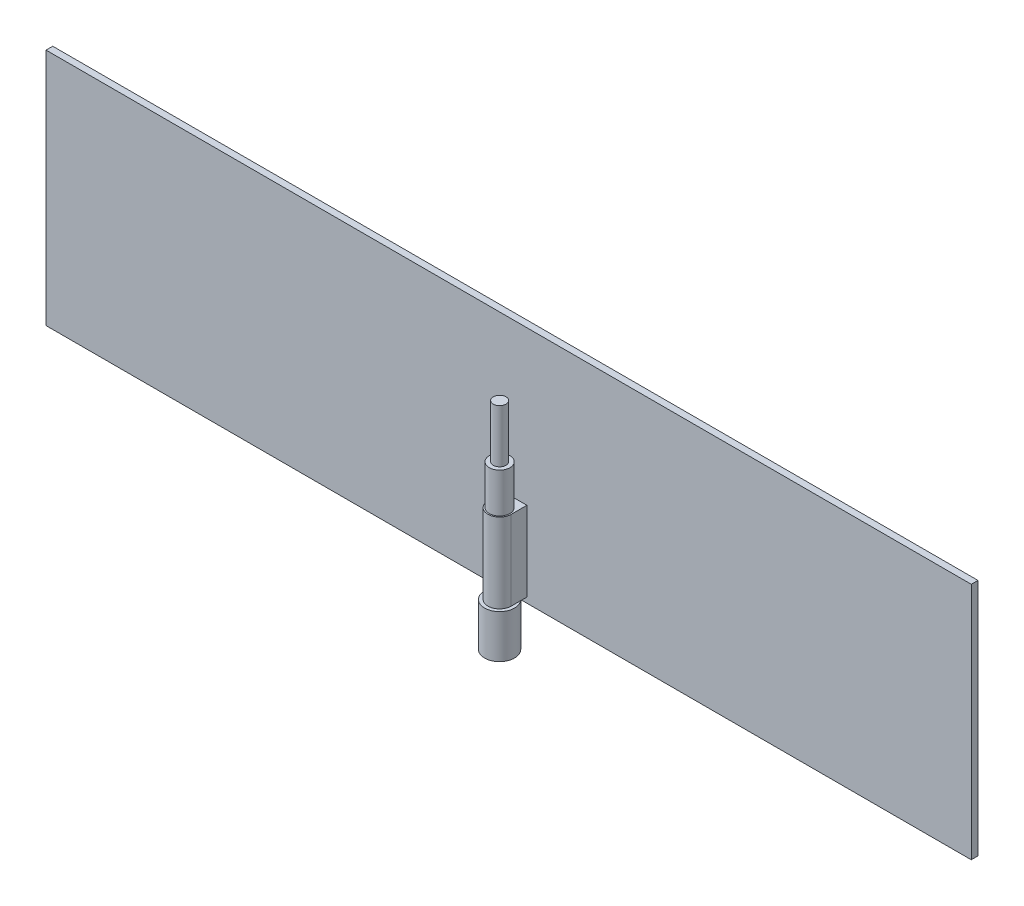
ISO-10303-21;
HEADER;
FILE_DESCRIPTION(('STEP AP214'),'2;1');
FILE_NAME('part.step','',(''),(''),'','','');
FILE_SCHEMA(('AUTOMOTIVE_DESIGN { 1 0 10303 214 1 1 1 1 }'));
ENDSEC;
DATA;
#1=APPLICATION_CONTEXT('core data for automotive mechanical design processes');
#2=APPLICATION_PROTOCOL_DEFINITION('international standard','automotive_design',2000,#1);
#3=PRODUCT_CONTEXT('',#1,'mechanical');
#4=PRODUCT('Part','Part','',(#3));
#5=PRODUCT_RELATED_PRODUCT_CATEGORY('part','',(#4));
#6=PRODUCT_DEFINITION_FORMATION('','',#4);
#7=PRODUCT_DEFINITION_CONTEXT('part definition',#1,'design');
#8=PRODUCT_DEFINITION('design','',#6,#7);
#9=PRODUCT_DEFINITION_SHAPE('','',#8);
#10=(LENGTH_UNIT() NAMED_UNIT(*) SI_UNIT(.MILLI.,.METRE.));
#11=(NAMED_UNIT(*) PLANE_ANGLE_UNIT() SI_UNIT($,.RADIAN.));
#12=(NAMED_UNIT(*) SI_UNIT($,.STERADIAN.) SOLID_ANGLE_UNIT());
#13=UNCERTAINTY_MEASURE_WITH_UNIT(LENGTH_MEASURE(1.E-05),#10,'distance_accuracy_value','');
#14=(GEOMETRIC_REPRESENTATION_CONTEXT(3) GLOBAL_UNCERTAINTY_ASSIGNED_CONTEXT((#13)) GLOBAL_UNIT_ASSIGNED_CONTEXT((#10,
#11,#12)) REPRESENTATION_CONTEXT('',''));
#15=CARTESIAN_POINT('',(0.,0.,0.));
#16=DIRECTION('',(0.,0.,1.));
#17=DIRECTION('',(1.,0.,0.));
#18=AXIS2_PLACEMENT_3D('',#15,#16,#17);
#19=CARTESIAN_POINT('',(0.,96.5,1.38499617894251));
#20=DIRECTION('',(0.,-1.,0.));
#21=DIRECTION('',(0.,0.,-1.));
#22=AXIS2_PLACEMENT_3D('',#19,#20,#21);
#23=CYLINDRICAL_SURFACE('',#22,0.389999999999991);
#24=CARTESIAN_POINT('',(0.,98.,1.38499617894251));
#25=DIRECTION('',(0.,-1.,0.));
#26=DIRECTION('',(0.,0.,-1.));
#27=AXIS2_PLACEMENT_3D('',#24,#25,#26);
#28=CIRCLE('',#27,0.389999999999991);
#29=CARTESIAN_POINT('',(0.,98.,0.99499617894252));
#30=VERTEX_POINT('',#29);
#31=EDGE_CURVE('E11',#30,#30,#28,.T.);
#32=ORIENTED_EDGE('',*,*,#31,.T.);
#33=EDGE_LOOP('',(#32));
#34=FACE_BOUND('',#33,.T.);
#35=CARTESIAN_POINT('',(0.,96.5,1.38499617894251));
#36=DIRECTION('',(0.,-1.,0.));
#37=DIRECTION('',(0.,0.,-1.));
#38=AXIS2_PLACEMENT_3D('',#35,#36,#37);
#39=CIRCLE('',#38,0.389999999999991);
#40=CARTESIAN_POINT('',(0.,96.5,0.99499617894252));
#41=VERTEX_POINT('',#40);
#42=EDGE_CURVE('E265',#41,#41,#39,.T.);
#43=ORIENTED_EDGE('',*,*,#42,.F.);
#44=EDGE_LOOP('',(#43));
#45=FACE_BOUND('',#44,.T.);
#46=ADVANCED_FACE('F51',(#34,#45),#23,.T.);
#47=CARTESIAN_POINT('',(0.,98.,1.6249961789425));
#48=DIRECTION('',(0.,-1.,0.));
#49=DIRECTION('',(0.,0.,-1.));
#50=AXIS2_PLACEMENT_3D('',#47,#48,#49);
#51=PLANE('',#50);
#52=CARTESIAN_POINT('',(0.,98.,1.38499617894251));
#53=DIRECTION('',(0.,-1.,0.));
#54=DIRECTION('',(0.,0.,-1.));
#55=AXIS2_PLACEMENT_3D('',#52,#53,#54);
#56=CIRCLE('',#55,0.239999999999991);
#57=CARTESIAN_POINT('',(0.,98.,1.14499617894252));
#58=VERTEX_POINT('',#57);
#59=EDGE_CURVE('E65',#58,#58,#56,.T.);
#60=ORIENTED_EDGE('',*,*,#59,.T.);
#61=EDGE_LOOP('',(#60));
#62=FACE_BOUND('',#61,.T.);
#63=ORIENTED_EDGE('',*,*,#31,.F.);
#64=EDGE_LOOP('',(#63));
#65=FACE_BOUND('',#64,.T.);
#66=ADVANCED_FACE('F322',(#62,#65),#51,.F.);
#67=CARTESIAN_POINT('',(0.,96.5,1.38499617894251));
#68=DIRECTION('',(0.,-1.,0.));
#69=DIRECTION('',(0.,0.,-1.));
#70=AXIS2_PLACEMENT_3D('',#67,#68,#69);
#71=CYLINDRICAL_SURFACE('',#70,0.239999999999991);
#72=CARTESIAN_POINT('',(0.,100.,1.38499617894251));
#73=DIRECTION('',(0.,-1.,0.));
#74=DIRECTION('',(0.,0.,-1.));
#75=AXIS2_PLACEMENT_3D('',#72,#73,#74);
#76=CIRCLE('',#75,0.239999999999991);
#77=CARTESIAN_POINT('',(0.,100.,1.14499617894252));
#78=VERTEX_POINT('',#77);
#79=EDGE_CURVE('E209',#78,#78,#76,.T.);
#80=ORIENTED_EDGE('',*,*,#79,.T.);
#81=EDGE_LOOP('',(#80));
#82=FACE_BOUND('',#81,.T.);
#83=ORIENTED_EDGE('',*,*,#59,.F.);
#84=EDGE_LOOP('',(#83));
#85=FACE_BOUND('',#84,.T.);
#86=ADVANCED_FACE('F332',(#82,#85),#71,.T.);
#87=CARTESIAN_POINT('',(0.,100.,1.38499617894251));
#88=DIRECTION('',(0.,-1.,0.));
#89=DIRECTION('',(0.,0.,-1.));
#90=AXIS2_PLACEMENT_3D('',#87,#88,#89);
#91=PLANE('',#90);
#92=ORIENTED_EDGE('',*,*,#79,.F.);
#93=EDGE_LOOP('',(#92));
#94=FACE_BOUND('',#93,.T.);
#95=ADVANCED_FACE('F341',(#94),#91,.F.);
#96=CARTESIAN_POINT('',(-0.00206148933976254,93.5,1.38499617894251));
#97=DIRECTION('',(0.,1.,0.));
#98=DIRECTION('',(1.,0.,0.));
#99=AXIS2_PLACEMENT_3D('',#96,#97,#98);
#100=PLANE('',#99);
#101=CARTESIAN_POINT('',(-0.00206148933976254,93.5,1.38499617894251));
#102=DIRECTION('',(0.,-1.,0.));
#103=DIRECTION('',(1.,0.,0.));
#104=AXIS2_PLACEMENT_3D('',#101,#102,#103);
#105=CIRCLE('',#104,0.565);
#106=CARTESIAN_POINT('',(-0.442061489339763,93.5,1.03056000697357));
#107=VERTEX_POINT('',#106);
#108=CARTESIAN_POINT('',(0.437938510660237,93.5,1.03056000697357));
#109=VERTEX_POINT('',#108);
#110=EDGE_CURVE('E261',#107,#109,#105,.T.);
#111=ORIENTED_EDGE('',*,*,#110,.F.);
#112=DIRECTION('',(0.,0.,1.));
#113=VECTOR('',#112,1.);
#114=CARTESIAN_POINT('',(-0.442061489339763,93.5,0.794996178942356));
#115=LINE('',#114,#113);
#116=CARTESIAN_POINT('',(-0.442061489339763,93.5,0.794996178942356));
#117=VERTEX_POINT('',#116);
#118=EDGE_CURVE('E124',#117,#107,#115,.T.);
#119=ORIENTED_EDGE('',*,*,#118,.F.);
#120=DIRECTION('',(-1.,0.,0.));
#121=VECTOR('',#120,1.);
#122=CARTESIAN_POINT('',(0.437938510660237,93.5,0.794996178942356));
#123=LINE('',#122,#121);
#124=CARTESIAN_POINT('',(0.437938510660237,93.5,0.794996178942356));
#125=VERTEX_POINT('',#124);
#126=EDGE_CURVE('E210',#125,#117,#123,.T.);
#127=ORIENTED_EDGE('',*,*,#126,.F.);
#128=DIRECTION('',(0.,0.,-1.));
#129=VECTOR('',#128,1.);
#130=CARTESIAN_POINT('',(0.437938510660237,93.5,1.38499617894251));
#131=LINE('',#130,#129);
#132=EDGE_CURVE('E211',#109,#125,#131,.T.);
#133=ORIENTED_EDGE('',*,*,#132,.F.);
#134=EDGE_LOOP('',(#111,#119,#127,#133));
#135=FACE_BOUND('',#134,.T.);
#136=ADVANCED_FACE('F310',(#135),#100,.F.);
#137=CARTESIAN_POINT('',(-0.00206148933976254,96.5,1.38499617894251));
#138=DIRECTION('',(0.,1.,0.));
#139=DIRECTION('',(1.,0.,0.));
#140=AXIS2_PLACEMENT_3D('',#137,#138,#139);
#141=PLANE('',#140);
#142=CARTESIAN_POINT('',(-0.00206148933976254,96.5,1.38499617894251));
#143=DIRECTION('',(0.,1.,0.));
#144=DIRECTION('',(1.,0.,0.));
#145=AXIS2_PLACEMENT_3D('',#142,#143,#144);
#146=CIRCLE('',#145,0.44);
#147=CARTESIAN_POINT('',(-0.442061489339763,96.5,1.38499617894251));
#148=VERTEX_POINT('',#147);
#149=CARTESIAN_POINT('',(0.437938510660237,96.5,1.38499617894251));
#150=VERTEX_POINT('',#149);
#151=EDGE_CURVE('E252',#148,#150,#146,.T.);
#152=ORIENTED_EDGE('',*,*,#151,.T.);
#153=DIRECTION('',(0.,0.,-1.));
#154=VECTOR('',#153,1.);
#155=CARTESIAN_POINT('',(0.437938510660237,96.5,1.38499617894251));
#156=LINE('',#155,#154);
#157=CARTESIAN_POINT('',(0.437938510660237,96.5,0.794996178942356));
#158=VERTEX_POINT('',#157);
#159=EDGE_CURVE('E213',#150,#158,#156,.T.);
#160=ORIENTED_EDGE('',*,*,#159,.T.);
#161=DIRECTION('',(-1.,0.,0.));
#162=VECTOR('',#161,1.);
#163=CARTESIAN_POINT('',(0.437938510660237,96.5,0.794996178942356));
#164=LINE('',#163,#162);
#165=CARTESIAN_POINT('',(-0.442061489339763,96.5,0.794996178942356));
#166=VERTEX_POINT('',#165);
#167=EDGE_CURVE('E235',#158,#166,#164,.T.);
#168=ORIENTED_EDGE('',*,*,#167,.T.);
#169=DIRECTION('',(0.,0.,1.));
#170=VECTOR('',#169,1.);
#171=CARTESIAN_POINT('',(-0.442061489339763,96.5,0.794996178942356));
#172=LINE('',#171,#170);
#173=EDGE_CURVE('E264',#166,#148,#172,.T.);
#174=ORIENTED_EDGE('',*,*,#173,.T.);
#175=EDGE_LOOP('',(#152,#160,#168,#174));
#176=FACE_BOUND('',#175,.T.);
#177=ORIENTED_EDGE('',*,*,#42,.T.);
#178=EDGE_LOOP('',(#177));
#179=FACE_BOUND('',#178,.T.);
#180=ADVANCED_FACE('F284',(#176,#179),#141,.T.);
#181=CARTESIAN_POINT('',(-0.442061489339763,96.5,0.794996178942356));
#182=DIRECTION('',(1.,0.,0.));
#183=DIRECTION('',(0.,0.,-1.));
#184=AXIS2_PLACEMENT_3D('',#181,#182,#183);
#185=PLANE('',#184);
#186=ORIENTED_EDGE('',*,*,#118,.T.);
#187=DIRECTION('',(0.,0.,1.));
#188=VECTOR('',#187,1.);
#189=CARTESIAN_POINT('',(-0.442061489339763,93.5,0.794996178942356));
#190=LINE('',#189,#188);
#191=CARTESIAN_POINT('',(-0.442061489339763,93.5,1.38499617894251));
#192=VERTEX_POINT('',#191);
#193=EDGE_CURVE('E178',#107,#192,#190,.T.);
#194=ORIENTED_EDGE('',*,*,#193,.T.);
#195=DIRECTION('',(0.,-1.,0.));
#196=VECTOR('',#195,1.);
#197=CARTESIAN_POINT('',(-0.442061489339763,96.5,1.38499617894251));
#198=LINE('',#197,#196);
#199=EDGE_CURVE('E102',#148,#192,#198,.T.);
#200=ORIENTED_EDGE('',*,*,#199,.F.);
#201=ORIENTED_EDGE('',*,*,#173,.F.);
#202=DIRECTION('',(0.,-1.,0.));
#203=VECTOR('',#202,1.);
#204=CARTESIAN_POINT('',(-0.442061489339763,96.5,0.794996178942356));
#205=LINE('',#204,#203);
#206=EDGE_CURVE('E237',#166,#117,#205,.T.);
#207=ORIENTED_EDGE('',*,*,#206,.T.);
#208=EDGE_LOOP('',(#186,#194,#200,#201,#207));
#209=FACE_BOUND('',#208,.T.);
#210=ADVANCED_FACE('F289',(#209),#185,.F.);
#211=CARTESIAN_POINT('',(0.437938510660237,96.5,1.38499617894251));
#212=DIRECTION('',(-1.,0.,0.));
#213=DIRECTION('',(0.,1.,0.));
#214=AXIS2_PLACEMENT_3D('',#211,#212,#213);
#215=PLANE('',#214);
#216=DIRECTION('',(0.,0.,-1.));
#217=VECTOR('',#216,1.);
#218=CARTESIAN_POINT('',(0.437938510660237,93.5,1.38499617894251));
#219=LINE('',#218,#217);
#220=CARTESIAN_POINT('',(0.437938510660237,93.5,1.38499617894251));
#221=VERTEX_POINT('',#220);
#222=EDGE_CURVE('E260',#221,#109,#219,.T.);
#223=ORIENTED_EDGE('',*,*,#222,.T.);
#224=ORIENTED_EDGE('',*,*,#132,.T.);
#225=DIRECTION('',(0.,-1.,0.));
#226=VECTOR('',#225,1.);
#227=CARTESIAN_POINT('',(0.437938510660237,96.5,0.794996178942356));
#228=LINE('',#227,#226);
#229=EDGE_CURVE('E188',#158,#125,#228,.T.);
#230=ORIENTED_EDGE('',*,*,#229,.F.);
#231=ORIENTED_EDGE('',*,*,#159,.F.);
#232=DIRECTION('',(0.,-1.,0.));
#233=VECTOR('',#232,1.);
#234=CARTESIAN_POINT('',(0.437938510660237,96.5,1.38499617894251));
#235=LINE('',#234,#233);
#236=EDGE_CURVE('E256',#150,#221,#235,.T.);
#237=ORIENTED_EDGE('',*,*,#236,.T.);
#238=EDGE_LOOP('',(#223,#224,#230,#231,#237));
#239=FACE_BOUND('',#238,.T.);
#240=ADVANCED_FACE('F52',(#239),#215,.F.);
#241=CARTESIAN_POINT('',(-0.00206148933976254,96.5,1.38499617894251));
#242=DIRECTION('',(0.,-1.,0.));
#243=DIRECTION('',(0.,0.,-1.));
#244=AXIS2_PLACEMENT_3D('',#241,#242,#243);
#245=CYLINDRICAL_SURFACE('',#244,0.44);
#246=CARTESIAN_POINT('',(-0.00206148933976254,93.5,1.38499617894251));
#247=DIRECTION('',(0.,1.,0.));
#248=DIRECTION('',(1.,0.,0.));
#249=AXIS2_PLACEMENT_3D('',#246,#247,#248);
#250=CIRCLE('',#249,0.44);
#251=EDGE_CURVE('E276',#192,#221,#250,.T.);
#252=ORIENTED_EDGE('',*,*,#251,.T.);
#253=ORIENTED_EDGE('',*,*,#236,.F.);
#254=ORIENTED_EDGE('',*,*,#151,.F.);
#255=ORIENTED_EDGE('',*,*,#199,.T.);
#256=EDGE_LOOP('',(#252,#253,#254,#255));
#257=FACE_BOUND('',#256,.T.);
#258=ADVANCED_FACE('F288',(#257),#245,.T.);
#259=CARTESIAN_POINT('',(-0.00206148933976104,9.075,1.38499617894251));
#260=DIRECTION('',(0.,1.,0.));
#261=DIRECTION('',(1.,0.,0.));
#262=AXIS2_PLACEMENT_3D('',#259,#260,#261);
#263=CYLINDRICAL_SURFACE('',#262,0.565);
#264=CARTESIAN_POINT('',(-0.00206148933976104,91.8655364343951,1.3849961789425));
#265=DIRECTION('',(0.,1.,0.));
#266=DIRECTION('',(0.,0.,1.));
#267=AXIS2_PLACEMENT_3D('',#264,#265,#266);
#268=CIRCLE('',#267,0.565);
#269=CARTESIAN_POINT('',(-0.00206148933976104,91.8655364343951,1.9499961789425));
#270=VERTEX_POINT('',#269);
#271=EDGE_CURVE('E54',#270,#270,#268,.F.);
#272=ORIENTED_EDGE('',*,*,#271,.F.);
#273=EDGE_LOOP('',(#272));
#274=FACE_BOUND('',#273,.T.);
#275=ORIENTED_EDGE('',*,*,#110,.T.);
#276=CARTESIAN_POINT('',(-0.00206148933976254,93.5,1.38499617894251));
#277=DIRECTION('',(0.,-1.,0.));
#278=DIRECTION('',(1.,0.,0.));
#279=AXIS2_PLACEMENT_3D('',#276,#277,#278);
#280=CIRCLE('',#279,0.565);
#281=EDGE_CURVE('E255',#109,#107,#280,.T.);
#282=ORIENTED_EDGE('',*,*,#281,.T.);
#283=EDGE_LOOP('',(#275,#282));
#284=FACE_BOUND('',#283,.T.);
#285=ADVANCED_FACE('F307',(#274,#284),#263,.T.);
#286=CARTESIAN_POINT('',(-0.00206148933976254,93.5,1.38499617894251));
#287=DIRECTION('',(0.,-1.,0.));
#288=DIRECTION('',(0.,0.,-1.));
#289=AXIS2_PLACEMENT_3D('',#286,#287,#288);
#290=PLANE('',#289);
#291=ORIENTED_EDGE('',*,*,#193,.F.);
#292=ORIENTED_EDGE('',*,*,#281,.F.);
#293=ORIENTED_EDGE('',*,*,#222,.F.);
#294=ORIENTED_EDGE('',*,*,#251,.F.);
#295=EDGE_LOOP('',(#291,#292,#293,#294));
#296=FACE_BOUND('',#295,.T.);
#297=ADVANCED_FACE('F302',(#296),#290,.F.);
#298=CARTESIAN_POINT('',(-17.7,0.,0.));
#299=DIRECTION('',(1.,0.,0.));
#300=DIRECTION('',(0.,1.,0.));
#301=AXIS2_PLACEMENT_3D('',#298,#299,#300);
#302=PLANE('',#301);
#303=DIRECTION('',(0.,0.,-1.));
#304=VECTOR('',#303,1.);
#305=CARTESIAN_POINT('',(-17.7,93.3,0.794996178942541));
#306=LINE('',#305,#304);
#307=CARTESIAN_POINT('',(-17.7,93.3,0.794996178942541));
#308=VERTEX_POINT('',#307);
#309=CARTESIAN_POINT('',(-17.7,93.3,0.541596178942538));
#310=VERTEX_POINT('',#309);
#311=EDGE_CURVE('E224',#308,#310,#306,.T.);
#312=ORIENTED_EDGE('',*,*,#311,.F.);
#313=DIRECTION('',(0.,-1.,0.));
#314=VECTOR('',#313,1.);
#315=CARTESIAN_POINT('',(-17.7,102.3,0.794996178942541));
#316=LINE('',#315,#314);
#317=CARTESIAN_POINT('',(-17.7,102.3,0.794996178942541));
#318=VERTEX_POINT('',#317);
#319=EDGE_CURVE('E177',#318,#308,#316,.T.);
#320=ORIENTED_EDGE('',*,*,#319,.F.);
#321=DIRECTION('',(0.,0.,1.));
#322=VECTOR('',#321,1.);
#323=CARTESIAN_POINT('',(-17.7,102.3,0.541596178942541));
#324=LINE('',#323,#322);
#325=CARTESIAN_POINT('',(-17.7,102.3,0.541596178942541));
#326=VERTEX_POINT('',#325);
#327=EDGE_CURVE('E193',#326,#318,#324,.T.);
#328=ORIENTED_EDGE('',*,*,#327,.F.);
#329=DIRECTION('',(0.,1.,0.));
#330=VECTOR('',#329,1.);
#331=CARTESIAN_POINT('',(-17.7,93.3,0.541596178942538));
#332=LINE('',#331,#330);
#333=EDGE_CURVE('E231',#310,#326,#332,.T.);
#334=ORIENTED_EDGE('',*,*,#333,.F.);
#335=EDGE_LOOP('',(#312,#320,#328,#334));
#336=FACE_BOUND('',#335,.T.);
#337=ADVANCED_FACE('F319',(#336),#302,.F.);
#338=CARTESIAN_POINT('',(17.2,0.,0.));
#339=DIRECTION('',(1.,0.,0.));
#340=DIRECTION('',(0.,1.,0.));
#341=AXIS2_PLACEMENT_3D('',#338,#339,#340);
#342=PLANE('',#341);
#343=DIRECTION('',(0.,0.,-1.));
#344=VECTOR('',#343,1.);
#345=CARTESIAN_POINT('',(17.2,93.3,0.794996178942541));
#346=LINE('',#345,#344);
#347=CARTESIAN_POINT('',(17.2,93.3,0.794996178942541));
#348=VERTEX_POINT('',#347);
#349=CARTESIAN_POINT('',(17.2,93.3,0.541596178942538));
#350=VERTEX_POINT('',#349);
#351=EDGE_CURVE('E225',#348,#350,#346,.T.);
#352=ORIENTED_EDGE('',*,*,#351,.T.);
#353=DIRECTION('',(0.,1.,0.));
#354=VECTOR('',#353,1.);
#355=CARTESIAN_POINT('',(17.2,93.3,0.541596178942538));
#356=LINE('',#355,#354);
#357=CARTESIAN_POINT('',(17.2,102.3,0.541596178942541));
#358=VERTEX_POINT('',#357);
#359=EDGE_CURVE('E183',#350,#358,#356,.T.);
#360=ORIENTED_EDGE('',*,*,#359,.T.);
#361=DIRECTION('',(0.,0.,1.));
#362=VECTOR('',#361,1.);
#363=CARTESIAN_POINT('',(17.2,102.3,0.541596178942541));
#364=LINE('',#363,#362);
#365=CARTESIAN_POINT('',(17.2,102.3,0.794996178942541));
#366=VERTEX_POINT('',#365);
#367=EDGE_CURVE('E181',#358,#366,#364,.T.);
#368=ORIENTED_EDGE('',*,*,#367,.T.);
#369=DIRECTION('',(0.,-1.,0.));
#370=VECTOR('',#369,1.);
#371=CARTESIAN_POINT('',(17.2,102.3,0.794996178942541));
#372=LINE('',#371,#370);
#373=EDGE_CURVE('E167',#366,#348,#372,.T.);
#374=ORIENTED_EDGE('',*,*,#373,.T.);
#375=EDGE_LOOP('',(#352,#360,#368,#374));
#376=FACE_BOUND('',#375,.T.);
#377=ADVANCED_FACE('F184',(#376),#342,.T.);
#378=CARTESIAN_POINT('',(17.2,102.3,0.794996178942541));
#379=DIRECTION('',(0.,0.,-1.));
#380=DIRECTION('',(0.,-1.,0.));
#381=AXIS2_PLACEMENT_3D('',#378,#379,#380);
#382=PLANE('',#381);
#383=ORIENTED_EDGE('',*,*,#319,.T.);
#384=DIRECTION('',(-1.,0.,0.));
#385=VECTOR('',#384,1.);
#386=CARTESIAN_POINT('',(17.2,93.3,0.794996178942541));
#387=LINE('',#386,#385);
#388=EDGE_CURVE('E171',#348,#308,#387,.T.);
#389=ORIENTED_EDGE('',*,*,#388,.F.);
#390=ORIENTED_EDGE('',*,*,#373,.F.);
#391=DIRECTION('',(-1.,0.,0.));
#392=VECTOR('',#391,1.);
#393=CARTESIAN_POINT('',(17.2,102.3,0.794996178942541));
#394=LINE('',#393,#392);
#395=EDGE_CURVE('E172',#366,#318,#394,.T.);
#396=ORIENTED_EDGE('',*,*,#395,.T.);
#397=EDGE_LOOP('',(#383,#389,#390,#396));
#398=FACE_BOUND('',#397,.T.);
#399=ORIENTED_EDGE('',*,*,#229,.T.);
#400=ORIENTED_EDGE('',*,*,#126,.T.);
#401=ORIENTED_EDGE('',*,*,#206,.F.);
#402=ORIENTED_EDGE('',*,*,#167,.F.);
#403=EDGE_LOOP('',(#399,#400,#401,#402));
#404=FACE_BOUND('',#403,.T.);
#405=ADVANCED_FACE('F169',(#398,#404),#382,.F.);
#406=CARTESIAN_POINT('',(17.2,102.3,0.541596178942541));
#407=DIRECTION('',(0.,-1.,0.));
#408=DIRECTION('',(0.,0.,-1.));
#409=AXIS2_PLACEMENT_3D('',#406,#407,#408);
#410=PLANE('',#409);
#411=ORIENTED_EDGE('',*,*,#327,.T.);
#412=ORIENTED_EDGE('',*,*,#395,.F.);
#413=ORIENTED_EDGE('',*,*,#367,.F.);
#414=DIRECTION('',(-1.,0.,0.));
#415=VECTOR('',#414,1.);
#416=CARTESIAN_POINT('',(17.2,102.3,0.541596178942541));
#417=LINE('',#416,#415);
#418=EDGE_CURVE('E220',#358,#326,#417,.T.);
#419=ORIENTED_EDGE('',*,*,#418,.T.);
#420=EDGE_LOOP('',(#411,#412,#413,#419));
#421=FACE_BOUND('',#420,.T.);
#422=ADVANCED_FACE('F191',(#421),#410,.F.);
#423=CARTESIAN_POINT('',(17.2,93.3,0.541596178942538));
#424=DIRECTION('',(0.,0.,1.));
#425=DIRECTION('',(0.,-1.,0.));
#426=AXIS2_PLACEMENT_3D('',#423,#424,#425);
#427=PLANE('',#426);
#428=ORIENTED_EDGE('',*,*,#333,.T.);
#429=ORIENTED_EDGE('',*,*,#418,.F.);
#430=ORIENTED_EDGE('',*,*,#359,.F.);
#431=DIRECTION('',(-1.,0.,0.));
#432=VECTOR('',#431,1.);
#433=CARTESIAN_POINT('',(17.2,93.3,0.541596178942538));
#434=LINE('',#433,#432);
#435=EDGE_CURVE('E217',#350,#310,#434,.T.);
#436=ORIENTED_EDGE('',*,*,#435,.T.);
#437=EDGE_LOOP('',(#428,#429,#430,#436));
#438=FACE_BOUND('',#437,.T.);
#439=ADVANCED_FACE('F320',(#438),#427,.F.);
#440=CARTESIAN_POINT('',(17.2,93.3,0.794996178942541));
#441=DIRECTION('',(0.,1.,0.));
#442=DIRECTION('',(1.,0.,0.));
#443=AXIS2_PLACEMENT_3D('',#440,#441,#442);
#444=PLANE('',#443);
#445=ORIENTED_EDGE('',*,*,#311,.T.);
#446=ORIENTED_EDGE('',*,*,#435,.F.);
#447=ORIENTED_EDGE('',*,*,#351,.F.);
#448=ORIENTED_EDGE('',*,*,#388,.T.);
#449=EDGE_LOOP('',(#445,#446,#447,#448));
#450=FACE_BOUND('',#449,.T.);
#451=ADVANCED_FACE('F353',(#450),#444,.F.);
#452=CARTESIAN_POINT('',(-17.3268502521758,91.8655364343951,-22.2050038210575));
#453=DIRECTION('',(0.,1.,0.));
#454=DIRECTION('',(0.,0.,1.));
#455=AXIS2_PLACEMENT_3D('',#452,#453,#454);
#456=PLANE('',#455);
#457=ORIENTED_EDGE('',*,*,#271,.T.);
#458=EDGE_LOOP('',(#457));
#459=FACE_BOUND('',#458,.T.);
#460=ADVANCED_FACE('F351',(#459),#456,.F.);
#461=CLOSED_SHELL('',(#46,#66,#86,#95,#136,#180,#210,#240,#258,#285,#297,#337,#377,#405,#422,
#439,#451,#460));
#462=MANIFOLD_SOLID_BREP('B2',#461);
#463=ADVANCED_BREP_SHAPE_REPRESENTATION('',(#18,#462),#14);
#464=SHAPE_DEFINITION_REPRESENTATION(#9,#463);
ENDSEC;
END-ISO-10303-21;
